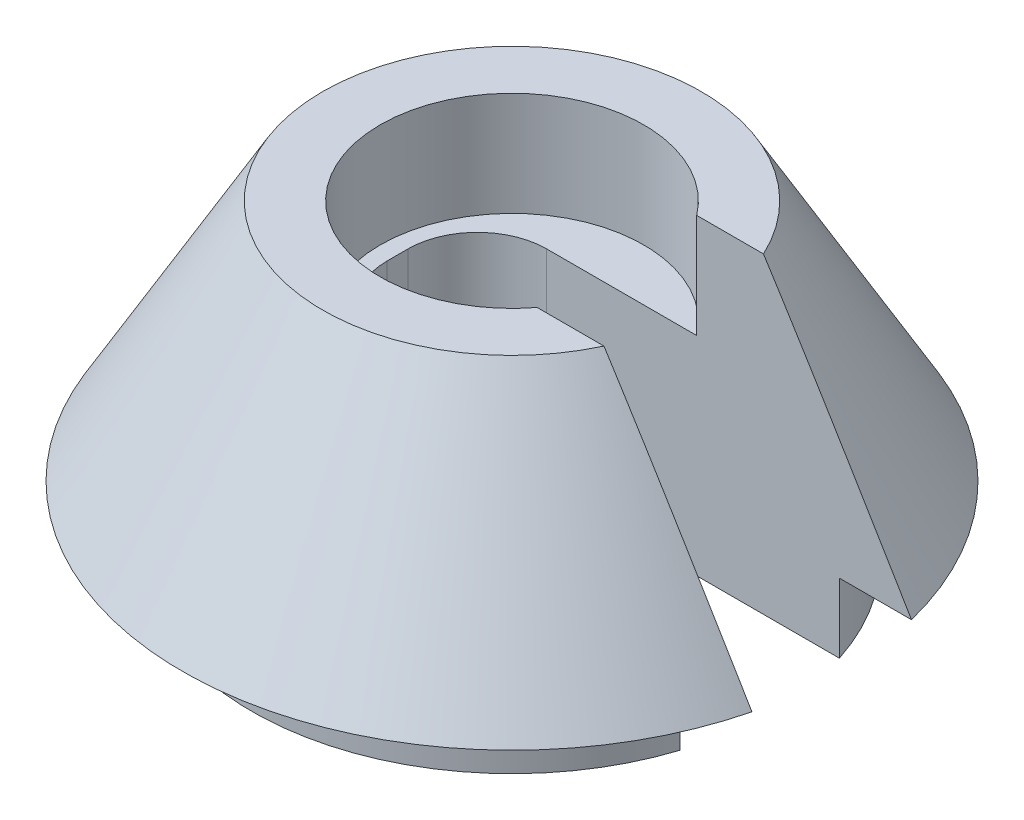
ISO-10303-21;
HEADER;
FILE_DESCRIPTION(('STEP AP214'),'2;1');
FILE_NAME('part.step','',(''),(''),'','','');
FILE_SCHEMA(('AUTOMOTIVE_DESIGN { 1 0 10303 214 1 1 1 1 }'));
ENDSEC;
DATA;
#1=APPLICATION_CONTEXT('core data for automotive mechanical design processes');
#2=APPLICATION_PROTOCOL_DEFINITION('international standard','automotive_design',2000,#1);
#3=PRODUCT_CONTEXT('',#1,'mechanical');
#4=PRODUCT('Part','Part','',(#3));
#5=PRODUCT_RELATED_PRODUCT_CATEGORY('part','',(#4));
#6=PRODUCT_DEFINITION_FORMATION('','',#4);
#7=PRODUCT_DEFINITION_CONTEXT('part definition',#1,'design');
#8=PRODUCT_DEFINITION('design','',#6,#7);
#9=PRODUCT_DEFINITION_SHAPE('','',#8);
#10=(LENGTH_UNIT() NAMED_UNIT(*) SI_UNIT(.MILLI.,.METRE.));
#11=(NAMED_UNIT(*) PLANE_ANGLE_UNIT() SI_UNIT($,.RADIAN.));
#12=(NAMED_UNIT(*) SI_UNIT($,.STERADIAN.) SOLID_ANGLE_UNIT());
#13=UNCERTAINTY_MEASURE_WITH_UNIT(LENGTH_MEASURE(1.E-05),#10,'distance_accuracy_value','');
#14=(GEOMETRIC_REPRESENTATION_CONTEXT(3) GLOBAL_UNCERTAINTY_ASSIGNED_CONTEXT((#13)) GLOBAL_UNIT_ASSIGNED_CONTEXT((#10,
#11,#12)) REPRESENTATION_CONTEXT('',''));
#15=CARTESIAN_POINT('',(0.,0.,0.));
#16=DIRECTION('',(0.,0.,1.));
#17=DIRECTION('',(1.,0.,0.));
#18=AXIS2_PLACEMENT_3D('',#15,#16,#17);
#19=CARTESIAN_POINT('',(0.,2.,0.));
#20=DIRECTION('',(0.,-1.,0.));
#21=DIRECTION('',(0.,0.,-1.));
#22=AXIS2_PLACEMENT_3D('',#19,#20,#21);
#23=CYLINDRICAL_SURFACE('',#22,7.5);
#24=CARTESIAN_POINT('',(0.,2.,0.));
#25=DIRECTION('',(0.,1.,0.));
#26=DIRECTION('',(0.,0.,1.));
#27=AXIS2_PLACEMENT_3D('',#24,#25,#26);
#28=CIRCLE('',#27,7.5);
#29=CARTESIAN_POINT('',(7.1386273190299,2.,-2.3));
#30=VERTEX_POINT('',#29);
#31=CARTESIAN_POINT('',(7.1386273190299,2.,2.3));
#32=VERTEX_POINT('',#31);
#33=EDGE_CURVE('E197',#30,#32,#28,.T.);
#34=ORIENTED_EDGE('',*,*,#33,.F.);
#35=DIRECTION('',(0.,-1.,0.));
#36=VECTOR('',#35,1.);
#37=CARTESIAN_POINT('',(7.1386273190299,2.,-2.3));
#38=LINE('',#37,#36);
#39=CARTESIAN_POINT('',(7.1386273190299,0.,-2.3));
#40=VERTEX_POINT('',#39);
#41=EDGE_CURVE('E57',#30,#40,#38,.T.);
#42=ORIENTED_EDGE('',*,*,#41,.T.);
#43=CARTESIAN_POINT('',(0.,0.,0.));
#44=DIRECTION('',(0.,1.,0.));
#45=DIRECTION('',(0.,0.,1.));
#46=AXIS2_PLACEMENT_3D('',#43,#44,#45);
#47=CIRCLE('',#46,7.5);
#48=CARTESIAN_POINT('',(7.1386273190299,0.,2.3));
#49=VERTEX_POINT('',#48);
#50=EDGE_CURVE('E199',#40,#49,#47,.T.);
#51=ORIENTED_EDGE('',*,*,#50,.T.);
#52=DIRECTION('',(0.,-1.,0.));
#53=VECTOR('',#52,1.);
#54=CARTESIAN_POINT('',(7.1386273190299,2.,2.3));
#55=LINE('',#54,#53);
#56=EDGE_CURVE('E124',#49,#32,#55,.F.);
#57=ORIENTED_EDGE('',*,*,#56,.T.);
#58=EDGE_LOOP('',(#34,#42,#51,#57));
#59=FACE_BOUND('',#58,.T.);
#60=ADVANCED_FACE('F35',(#59),#23,.T.);
#61=CARTESIAN_POINT('',(0.,0.,0.));
#62=DIRECTION('',(0.,1.,0.));
#63=DIRECTION('',(0.,0.,1.));
#64=AXIS2_PLACEMENT_3D('',#61,#62,#63);
#65=PLANE('',#64);
#66=ORIENTED_EDGE('',*,*,#50,.F.);
#67=DIRECTION('',(1.,0.,0.));
#68=VECTOR('',#67,1.);
#69=CARTESIAN_POINT('',(-1.3,0.,-2.3));
#70=LINE('',#69,#68);
#71=CARTESIAN_POINT('',(-1.3,0.,-2.3));
#72=VERTEX_POINT('',#71);
#73=EDGE_CURVE('E140',#72,#40,#70,.T.);
#74=ORIENTED_EDGE('',*,*,#73,.F.);
#75=CARTESIAN_POINT('',(-1.3,0.,-0.3));
#76=DIRECTION('',(0.,-1.,0.));
#77=DIRECTION('',(0.,0.,1.));
#78=AXIS2_PLACEMENT_3D('',#75,#76,#77);
#79=CIRCLE('',#78,2.);
#80=CARTESIAN_POINT('',(-3.3,0.,-0.3));
#81=VERTEX_POINT('',#80);
#82=EDGE_CURVE('E134',#81,#72,#79,.T.);
#83=ORIENTED_EDGE('',*,*,#82,.F.);
#84=DIRECTION('',(0.,0.,-1.));
#85=VECTOR('',#84,1.);
#86=CARTESIAN_POINT('',(-3.3,0.,0.3));
#87=LINE('',#86,#85);
#88=CARTESIAN_POINT('',(-3.3,0.,0.3));
#89=VERTEX_POINT('',#88);
#90=EDGE_CURVE('E132',#89,#81,#87,.T.);
#91=ORIENTED_EDGE('',*,*,#90,.F.);
#92=CARTESIAN_POINT('',(-1.3,0.,0.3));
#93=DIRECTION('',(0.,-1.,0.));
#94=DIRECTION('',(0.,0.,-1.));
#95=AXIS2_PLACEMENT_3D('',#92,#93,#94);
#96=CIRCLE('',#95,2.);
#97=CARTESIAN_POINT('',(-1.3,0.,2.3));
#98=VERTEX_POINT('',#97);
#99=EDGE_CURVE('E112',#98,#89,#96,.T.);
#100=ORIENTED_EDGE('',*,*,#99,.F.);
#101=DIRECTION('',(-1.,0.,0.));
#102=VECTOR('',#101,1.);
#103=CARTESIAN_POINT('',(-1.3,0.,2.3));
#104=LINE('',#103,#102);
#105=EDGE_CURVE('E121',#49,#98,#104,.T.);
#106=ORIENTED_EDGE('',*,*,#105,.F.);
#107=EDGE_LOOP('',(#66,#74,#83,#91,#100,#106));
#108=FACE_BOUND('',#107,.T.);
#109=ADVANCED_FACE('F129',(#108),#65,.F.);
#110=CARTESIAN_POINT('',(0.,2.,0.));
#111=DIRECTION('',(0.,-1.,0.));
#112=DIRECTION('',(0.,0.,1.));
#113=AXIS2_PLACEMENT_3D('',#110,#111,#112);
#114=CONICAL_SURFACE('',#113,9.5,0.523598775598299);
#115=CARTESIAN_POINT('',(0.,9.,0.));
#116=DIRECTION('',(0.,1.,0.));
#117=DIRECTION('',(0.,0.,1.));
#118=AXIS2_PLACEMENT_3D('',#115,#116,#117);
#119=CIRCLE('',#118,5.45854811567261);
#120=CARTESIAN_POINT('',(4.95032802257719,9.,-2.3));
#121=VERTEX_POINT('',#120);
#122=CARTESIAN_POINT('',(4.9503280225772,9.,2.3));
#123=VERTEX_POINT('',#122);
#124=EDGE_CURVE('E202',#121,#123,#119,.T.);
#125=ORIENTED_EDGE('',*,*,#124,.F.);
#126=CARTESIAN_POINT('',(-9.02227226073416,2.32766679770154,-2.3));
#127=CARTESIAN_POINT('',(-8.76048081901102,2.76699331251077,-2.3));
#128=CARTESIAN_POINT('',(-8.4982234552487,3.20604381628601,-2.3));
#129=CARTESIAN_POINT('',(-7.97231107192896,4.08340899491022,-2.3));
#130=CARTESIAN_POINT('',(-7.70865582039627,4.52172353065726,-2.3));
#131=CARTESIAN_POINT('',(-7.17811253297956,5.39969624100742,-2.3));
#132=CARTESIAN_POINT('',(-6.91121468758503,5.83934849607817,-2.3));
#133=CARTESIAN_POINT('',(-6.37495789635586,6.71705752377118,-2.3));
#134=CARTESIAN_POINT('',(-6.10559933638778,7.15511453197367,-2.3));
#135=CARTESIAN_POINT('',(-5.55842520019664,8.03684403645215,-2.3));
#136=CARTESIAN_POINT('',(-5.28054459019501,8.48047634095248,-2.3));
#137=CARTESIAN_POINT('',(-4.85931284397125,9.14327504399018,-2.3));
#138=CARTESIAN_POINT('',(-4.71813215244396,9.3638197845287,-2.3));
#139=CARTESIAN_POINT('',(-4.43390068329386,9.80369367167796,-2.3));
#140=CARTESIAN_POINT('',(-4.2908499602841,10.0230228535231,-2.3));
#141=CARTESIAN_POINT('',(-4.00270052749667,10.4594718070054,-2.3));
#142=CARTESIAN_POINT('',(-3.85760852180716,10.6765959924094,-2.3));
#143=CARTESIAN_POINT('',(-3.5641580596759,11.1086179141015,-2.3));
#144=CARTESIAN_POINT('',(-3.41579973013529,11.3235157364114,-2.3));
#145=CARTESIAN_POINT('',(-3.11465162541859,11.7499740103536,-2.3));
#146=CARTESIAN_POINT('',(-2.96186521416853,11.9615368161789,-2.3));
#147=CARTESIAN_POINT('',(-2.72772517259241,12.2751452427334,-2.3));
#148=CARTESIAN_POINT('',(-2.64886038607054,12.3790479274987,-2.3));
#149=CARTESIAN_POINT('',(-2.48907009561985,12.5852538000697,-2.3));
#150=CARTESIAN_POINT('',(-2.40814473721937,12.6875571000133,-2.3));
#151=CARTESIAN_POINT('',(-2.2986923644941,12.8223544524843,-2.3));
#152=CARTESIAN_POINT('',(-2.27131400829398,12.8557829894955,-2.3));
#153=CARTESIAN_POINT('',(-2.21624784689734,12.922385697809,-2.3));
#154=CARTESIAN_POINT('',(-2.18856003351631,12.9555598623444,-2.3));
#155=CARTESIAN_POINT('',(-2.10499151182393,13.0546665198831,-2.3));
#156=CARTESIAN_POINT('',(-2.048609601339,13.1201783830528,-2.3));
#157=CARTESIAN_POINT('',(-1.93406611944812,13.2500433163037,-2.3));
#158=CARTESIAN_POINT('',(-1.87589896605747,13.3143914767493,-2.3));
#159=CARTESIAN_POINT('',(-1.75767083595127,13.4413237231877,-2.3));
#160=CARTESIAN_POINT('',(-1.69760996891939,13.5039079109535,-2.3));
#161=CARTESIAN_POINT('',(-1.57061430466078,13.63142832615,-2.3));
#162=CARTESIAN_POINT('',(-1.50350184027373,13.6961888044607,-2.3));
#163=CARTESIAN_POINT('',(-1.36605729857718,13.8221903525793,-2.3));
#164=CARTESIAN_POINT('',(-1.2957261384372,13.8834324138818,-2.3));
#165=CARTESIAN_POINT('',(-1.15134812500449,14.0008713142326,-2.3));
#166=CARTESIAN_POINT('',(-1.07731568329189,14.057085657047,-2.3));
#167=CARTESIAN_POINT('',(-0.924566017389596,14.1626569964064,-2.3));
#168=CARTESIAN_POINT('',(-0.845855178656293,14.2120230464006,-2.3));
#169=CARTESIAN_POINT('',(-0.688597161091895,14.2979219788125,-2.3));
#170=CARTESIAN_POINT('',(-0.61041374579529,14.3351054945225,-2.3));
#171=CARTESIAN_POINT('',(-0.449453073535874,14.3976778087935,-2.3));
#172=CARTESIAN_POINT('',(-0.366683732132211,14.4230862628383,-2.3));
#173=CARTESIAN_POINT('',(-0.196724686216108,14.4589066011876,-2.3));
#174=CARTESIAN_POINT('',(-0.109492772838284,14.4691278080296,-2.3));
#175=CARTESIAN_POINT('',(0.0652602927911298,14.4720354842825,-2.3));
#176=CARTESIAN_POINT('',(0.152781396624484,14.464724753842,-2.3));
#177=CARTESIAN_POINT('',(0.330808845478698,14.4329075112669,-2.3));
#178=CARTESIAN_POINT('',(0.421097972123779,14.4072377862862,-2.3));
#179=CARTESIAN_POINT('',(0.596353986083074,14.3417260417928,-2.3));
#180=CARTESIAN_POINT('',(0.681308634660857,14.3018527393977,-2.3));
#181=CARTESIAN_POINT('',(0.855532952447854,14.20679276748,-2.3));
#182=CARTESIAN_POINT('',(0.944094346223919,14.1503416956198,-2.3));
#183=CARTESIAN_POINT('',(1.11539318251492,14.0291066724772,-2.3));
#184=CARTESIAN_POINT('',(1.19812003760868,13.9643081467688,-2.3));
#185=CARTESIAN_POINT('',(1.3593638729724,13.8286179616144,-2.3));
#186=CARTESIAN_POINT('',(1.43784673530756,13.7576862521284,-2.3));
#187=CARTESIAN_POINT('',(1.55264793943583,13.6483292830746,-2.3));
#188=CARTESIAN_POINT('',(1.59041359560839,13.6113987799076,-2.3));
#189=CARTESIAN_POINT('',(1.66508771055953,13.536682062011,-2.3));
#190=CARTESIAN_POINT('',(1.7019961946233,13.4988958725878,-2.3));
#191=CARTESIAN_POINT('',(1.81712591503382,13.3786564528829,-2.3));
#192=CARTESIAN_POINT('',(1.89396862641392,13.2948827358948,-2.3));
#193=CARTESIAN_POINT('',(2.04488268109945,13.1248667714919,-2.3));
#194=CARTESIAN_POINT('',(2.11895347889032,13.0386240440072,-2.3));
#195=CARTESIAN_POINT('',(2.26490681983974,12.8642205775673,-2.3));
#196=CARTESIAN_POINT('',(2.33678797495557,12.7760586803314,-2.3));
#197=CARTESIAN_POINT('',(2.47873003121087,12.5982787543074,-2.3));
#198=CARTESIAN_POINT('',(2.54879082925597,12.5086606435129,-2.3));
#199=CARTESIAN_POINT('',(2.75707158164951,12.2376554696934,-2.3));
#200=CARTESIAN_POINT('',(2.89304188021021,12.0545406648167,-2.3));
#201=CARTESIAN_POINT('',(3.16072862693392,11.6853544026872,-2.3));
#202=CARTESIAN_POINT('',(3.29244658383279,11.4992840298245,-2.3));
#203=CARTESIAN_POINT('',(3.55301861073383,11.1246828492051,-2.3));
#204=CARTESIAN_POINT('',(3.68186741922924,10.9361483897038,-2.3));
#205=CARTESIAN_POINT('',(3.93723765734981,10.5574906035089,-2.3));
#206=CARTESIAN_POINT('',(4.06375888458695,10.367367140719,-2.3));
#207=CARTESIAN_POINT('',(4.31479564116184,9.9862205942107,-2.3));
#208=CARTESIAN_POINT('',(4.43931395022681,9.79519933855271,-2.3));
#209=CARTESIAN_POINT('',(4.68691395403455,9.41223761712044,-2.3));
#210=CARTESIAN_POINT('',(4.80999569267582,9.22029717968849,-2.3));
#211=CARTESIAN_POINT('',(5.12730361679959,8.72220051158589,-2.3));
#212=CARTESIAN_POINT('',(5.32065135819332,8.41548493767876,-2.3));
#213=CARTESIAN_POINT('',(5.7052279115484,7.80072706083927,-2.3));
#214=CARTESIAN_POINT('',(5.89645670305176,7.49268474513731,-2.3));
#215=CARTESIAN_POINT('',(6.27731745981113,6.87559888526515,-2.3));
#216=CARTESIAN_POINT('',(6.46694936319041,6.56655530293421,-2.3));
#217=CARTESIAN_POINT('',(6.84496887346653,5.94770771807484,-2.3));
#218=CARTESIAN_POINT('',(7.03335647735985,5.63790371371336,-2.3));
#219=CARTESIAN_POINT('',(7.59735587972217,4.70711704328475,-2.3));
#220=CARTESIAN_POINT('',(7.97150426119612,4.08524788776677,-2.3));
#221=CARTESIAN_POINT('',(8.7172472013882,2.84000060640084,-2.3));
#222=CARTESIAN_POINT('',(9.08884181266399,2.21662251196668,-2.3));
#223=CARTESIAN_POINT('',(9.82108907009911,0.98423634727478,-2.3));
#224=CARTESIAN_POINT('',(10.1817851007458,0.375254043680828,-2.3));
#225=CARTESIAN_POINT('',(10.9019491162219,-0.843441421712044,-2.3));
#226=CARTESIAN_POINT('',(11.2614170927192,-1.45315458843187,-2.3));
#227=CARTESIAN_POINT('',(11.9790855462629,-2.67253479798948,-2.3));
#228=CARTESIAN_POINT('',(12.3372869112762,-3.28220131839225,-2.3));
#229=CARTESIAN_POINT('',(13.0529661156073,-4.50195189414921,-2.3));
#230=CARTESIAN_POINT('',(13.4104439611124,-5.11203594587253,-2.3));
#231=CARTESIAN_POINT('',(13.7676611312266,-5.72227226073416,-2.3));
#232=B_SPLINE_CURVE_WITH_KNOTS('',3,(#126,#127,#128,#129,#130,#131,#132,#133,#134,#135,#136,
#137,#138,#139,#140,#141,#142,#143,#144,#145,#146,#147,#148,#149,#150,#151,#152,#153,#154,#155,
#156,#157,#158,#159,#160,#161,#162,#163,#164,#165,#166,#167,#168,#169,#170,#171,#172,#173,#174,
#175,#176,#177,#178,#179,#180,#181,#182,#183,#184,#185,#186,#187,#188,#189,#190,#191,#192,#193,
#194,#195,#196,#197,#198,#199,#200,#201,#202,#203,#204,#205,#206,#207,#208,#209,#210,#211,#212,
#213,#214,#215,#216,#217,#218,#219,#220,#221,#222,#223,#224,#225,#226,#227,#228,#229,#230,#231),
.UNSPECIFIED.,.F.,.F.,(4,2,2,2,2,2,2,2,2,2,2,2,2,2,2,2,2,2,2,2,2,2,2,2,2,2,2,2,2,2,2,2,2,2,2,2,
2,2,2,2,2,2,2,2,2,2,2,2,2,2,2,2,4),(0.,1.53423867632177,3.06874046386846,4.61170426627738,
6.15443013234436,7.72482452498283,8.51040500480131,9.29596259328385,10.0793625859244,
10.8627321959259,11.6455215371996,12.0368331720317,12.4281172466326,12.5577435449833,
12.6873732798318,12.9466512469107,13.206844906438,13.4670235231628,13.7467198266648,
14.0263369208126,14.3049392121731,14.5831696077452,14.8421939478208,15.1007843409906,
15.3625947106191,15.6243632674664,15.9043800548083,16.1850174217522,16.4993789099429,
16.8142968985596,17.1314541709012,17.289908643071,17.448358435137,17.7893040352139,
18.1303163844949,18.4715405879661,18.8127840744414,19.4969136207938,20.1807977082458,
20.8658469246701,21.5509554286617,22.2350126751318,22.9190489632691,24.0067489459401,
25.0944594209805,26.1822118508074,27.2699669053184,29.44719593497,31.6243800213273,
33.7477360747015,35.8711065058468,37.9924294543908,40.1137341844115),.UNSPECIFIED.);
#233=CARTESIAN_POINT('',(9.21737489744233,2.,-2.3));
#234=VERTEX_POINT('',#233);
#235=EDGE_CURVE('E230',#121,#234,#232,.T.);
#236=ORIENTED_EDGE('',*,*,#235,.T.);
#237=CARTESIAN_POINT('',(0.,2.,0.));
#238=DIRECTION('',(0.,1.,0.));
#239=DIRECTION('',(0.,0.,1.));
#240=AXIS2_PLACEMENT_3D('',#237,#238,#239);
#241=CIRCLE('',#240,9.5);
#242=CARTESIAN_POINT('',(9.21737489744233,2.,2.3));
#243=VERTEX_POINT('',#242);
#244=EDGE_CURVE('E228',#234,#243,#241,.T.);
#245=ORIENTED_EDGE('',*,*,#244,.T.);
#246=CARTESIAN_POINT('',(13.7676611312266,-5.72227226073416,2.3));
#247=CARTESIAN_POINT('',(13.3946257402136,-5.08501709047818,2.3));
#248=CARTESIAN_POINT('',(13.0213081145206,-4.44792678060563,2.3));
#249=CARTESIAN_POINT('',(12.2738695985365,-3.17419866127775,2.3));
#250=CARTESIAN_POINT('',(11.8997486906679,-2.53756086213845,2.3));
#251=CARTESIAN_POINT('',(11.1497669507246,-1.26367539011608,2.3));
#252=CARTESIAN_POINT('',(10.7739041612337,-0.626428869008985,2.3));
#253=CARTESIAN_POINT('',(10.0207841519572,0.647222855149875,2.3));
#254=CARTESIAN_POINT('',(9.64352695977841,1.28362807452293,2.3));
#255=CARTESIAN_POINT('',(8.84979588506886,2.61793406097305,2.3));
#256=CARTESIAN_POINT('',(8.433120671541,3.31571526710163,2.3));
#257=CARTESIAN_POINT('',(7.80538707010242,4.3607835317233,2.3));
#258=CARTESIAN_POINT('',(7.59568231590529,4.7088834805976,2.3));
#259=CARTESIAN_POINT('',(7.1751159764022,5.40438357830228,2.3));
#260=CARTESIAN_POINT('',(6.96425439296672,5.75178372826293,2.3));
#261=CARTESIAN_POINT('',(6.54137761328337,6.44511396325762,2.3));
#262=CARTESIAN_POINT('',(6.32936482382185,6.79104551515455,2.3));
#263=CARTESIAN_POINT('',(5.90336370995101,7.48168908810181,2.3));
#264=CARTESIAN_POINT('',(5.6893753976263,7.82640111659435,2.3));
#265=CARTESIAN_POINT('',(5.25871428685164,8.51409313135961,2.3));
#266=CARTESIAN_POINT('',(5.04204178703912,8.85707330444352,2.3));
#267=CARTESIAN_POINT('',(4.60486832841559,9.54058132714478,2.3));
#268=CARTESIAN_POINT('',(4.38436749861839,9.88110925885704,2.3));
#269=CARTESIAN_POINT('',(4.0545448084372,10.3810591637524,2.3));
#270=CARTESIAN_POINT('',(3.94745820584747,10.5419549087546,2.3));
#271=CARTESIAN_POINT('',(3.73163044678484,10.8626495136596,2.3));
#272=CARTESIAN_POINT('',(3.62288918796933,11.0224483048199,2.3));
#273=CARTESIAN_POINT('',(3.40301219928779,11.3410754576042,2.3));
#274=CARTESIAN_POINT('',(3.29187045518707,11.4998996774231,2.3));
#275=CARTESIAN_POINT('',(3.06690651950596,11.81560643677,2.3));
#276=CARTESIAN_POINT('',(2.95308477570648,11.9724892940763,2.3));
#277=CARTESIAN_POINT('',(2.7236380677271,12.2812185167652,2.3));
#278=CARTESIAN_POINT('',(2.60806754760226,12.433105224892,2.3));
#279=CARTESIAN_POINT('',(2.3721332606971,12.7333220600954,2.3));
#280=CARTESIAN_POINT('',(2.25176626365555,12.8816496787385,2.3));
#281=CARTESIAN_POINT('',(2.0664809584897,13.0995807950363,2.3));
#282=CARTESIAN_POINT('',(2.0040702790718,13.1713140153739,2.3));
#283=CARTESIAN_POINT('',(1.87724292224634,13.3129797987885,2.3));
#284=CARTESIAN_POINT('',(1.81282645878833,13.3829125524707,2.3));
#285=CARTESIAN_POINT('',(1.68162904866014,13.5203715117652,2.3));
#286=CARTESIAN_POINT('',(1.61485108105909,13.5879005479677,2.3));
#287=CARTESIAN_POINT('',(1.47831794548817,13.7198625860499,2.3));
#288=CARTESIAN_POINT('',(1.40856381364093,13.784296649073,2.3));
#289=CARTESIAN_POINT('',(1.28446452305294,13.8923139259231,2.3));
#290=CARTESIAN_POINT('',(1.23097283899774,13.936873998916,2.3));
#291=CARTESIAN_POINT('',(1.1216466079429,14.0230995146661,2.3));
#292=CARTESIAN_POINT('',(1.06581097766614,14.0647635948549,2.3));
#293=CARTESIAN_POINT('',(0.951704965703614,14.1441378645687,2.3));
#294=CARTESIAN_POINT('',(0.893445441354485,14.1818634850189,2.3));
#295=CARTESIAN_POINT('',(0.77402467421746,14.2523529110068,2.3));
#296=CARTESIAN_POINT('',(0.712865499561458,14.2851201851207,2.3));
#297=CARTESIAN_POINT('',(0.574536152595027,14.3502875423334,2.3));
#298=CARTESIAN_POINT('',(0.496657058940019,14.3812305647362,2.3));
#299=CARTESIAN_POINT('',(0.336955328652336,14.4305297896837,2.3));
#300=CARTESIAN_POINT('',(0.25513666322159,14.4488983946231,2.3));
#301=CARTESIAN_POINT('',(0.0886913155234731,14.4704078109665,2.3));
#302=CARTESIAN_POINT('',(0.00404635291553642,14.4734142613611,2.3));
#303=CARTESIAN_POINT('',(-0.164228530990328,14.4632882333614,2.3));
#304=CARTESIAN_POINT('',(-0.247858186818413,14.4501516221066,2.3));
#305=CARTESIAN_POINT('',(-0.42797013235243,14.4059002133854,2.3));
#306=CARTESIAN_POINT('',(-0.52367896325873,14.3717159849582,2.3));
#307=CARTESIAN_POINT('',(-0.662252486999437,14.3096444282186,2.3));
#308=CARTESIAN_POINT('',(-0.707689448595765,14.2871042541352,2.3));
#309=CARTESIAN_POINT('',(-0.796956392647637,14.2390287929728,2.3));
#310=CARTESIAN_POINT('',(-0.840786499414785,14.2134937382323,2.3));
#311=CARTESIAN_POINT('',(-0.994305494784764,14.1181411278347,2.3));
#312=CARTESIAN_POINT('',(-1.0997650452158,14.0415368400698,2.3));
#313=CARTESIAN_POINT('',(-1.30293416162397,13.8786081854296,2.3));
#314=CARTESIAN_POINT('',(-1.40062616474463,13.7922628023275,2.3));
#315=CARTESIAN_POINT('',(-1.5907667447009,13.6127405113365,2.3));
#316=CARTESIAN_POINT('',(-1.68317381691367,13.5195200020207,2.3));
#317=CARTESIAN_POINT('',(-1.81832827696886,13.37657161714,2.3));
#318=CARTESIAN_POINT('',(-1.8627819335703,13.3284279144305,2.3));
#319=CARTESIAN_POINT('',(-1.9506971649821,13.2312442893348,2.3));
#320=CARTESIAN_POINT('',(-1.99415877588871,13.1822043996744,2.3));
#321=CARTESIAN_POINT('',(-2.13248479437058,13.0233543933406,2.3));
#322=CARTESIAN_POINT('',(-2.2256661734999,12.9120789965296,2.3));
#323=CARTESIAN_POINT('',(-2.40882399846606,12.6869129852964,2.3));
#324=CARTESIAN_POINT('',(-2.49879992313158,12.5730219505066,2.3));
#325=CARTESIAN_POINT('',(-2.67629008753612,12.3432510411781,2.3));
#326=CARTESIAN_POINT('',(-2.76380306374505,12.2273701932049,2.3));
#327=CARTESIAN_POINT('',(-2.93683564416563,11.9941271197814,2.3));
#328=CARTESIAN_POINT('',(-3.02235516408042,11.876764832008,2.3));
#329=CARTESIAN_POINT('',(-3.27685524841083,11.5224906160586,2.3));
#330=CARTESIAN_POINT('',(-3.44342815190518,11.2838506307626,2.3));
#331=CARTESIAN_POINT('',(-3.77217433125961,10.8036857189839,2.3));
#332=CARTESIAN_POINT('',(-3.93434889574194,10.5621616680048,2.3));
#333=CARTESIAN_POINT('',(-4.2552579972151,10.0775386939444,2.3));
#334=CARTESIAN_POINT('',(-4.41399877788363,9.83444389792703,2.3));
#335=CARTESIAN_POINT('',(-4.72919112376227,9.34675326354049,2.3));
#336=CARTESIAN_POINT('',(-4.88564252172293,9.10215731734018,2.3));
#337=CARTESIAN_POINT('',(-5.19662067991437,8.6121188191301,2.3));
#338=CARTESIAN_POINT('',(-5.35114934571052,8.3666774749462,2.3));
#339=CARTESIAN_POINT('',(-5.65883679152087,7.87493718655567,2.3));
#340=CARTESIAN_POINT('',(-5.81199556590894,7.62863823883264,2.3));
#341=CARTESIAN_POINT('',(-6.22386719805366,6.96303666100427,2.3));
#342=CARTESIAN_POINT('',(-6.48155732098889,6.54310140718518,2.3));
#343=CARTESIAN_POINT('',(-6.99482194145663,5.70175247544056,2.3));
#344=CARTESIAN_POINT('',(-7.25039571318198,5.2803383555824,2.3));
#345=CARTESIAN_POINT('',(-7.75941834348221,4.43738659139885,2.3));
#346=CARTESIAN_POINT('',(-8.01287044367205,4.01585090302552,2.3));
#347=CARTESIAN_POINT('',(-8.51845008316038,3.1721845295481,2.3));
#348=CARTESIAN_POINT('',(-8.77057805163473,2.75005410171954,2.3));
#349=CARTESIAN_POINT('',(-9.02227226073416,2.32766679770154,2.3));
#350=B_SPLINE_CURVE_WITH_KNOTS('',3,(#246,#247,#248,#249,#250,#251,#252,#253,#254,#255,#256,
#257,#258,#259,#260,#261,#262,#263,#264,#265,#266,#267,#268,#269,#270,#271,#272,#273,#274,#275,
#276,#277,#278,#279,#280,#281,#282,#283,#284,#285,#286,#287,#288,#289,#290,#291,#292,#293,#294,
#295,#296,#297,#298,#299,#300,#301,#302,#303,#304,#305,#306,#307,#308,#309,#310,#311,#312,#313,
#314,#315,#316,#317,#318,#319,#320,#321,#322,#323,#324,#325,#326,#327,#328,#329,#330,#331,#332,
#333,#334,#335,#336,#337,#338,#339,#340,#341,#342,#343,#344,#345,#346,#347,#348,#349),
.UNSPECIFIED.,.F.,.F.,(4,2,2,2,2,2,2,2,2,2,2,2,2,2,2,2,2,2,2,2,2,2,2,2,2,2,2,2,2,2,2,2,2,2,2,2,
2,2,2,2,2,2,2,2,2,2,2,2,2,2,2,4),(0.,2.21523083215538,4.43051064215589,6.65001447532256,
8.86947459884844,11.3076317744991,12.5267884228447,13.7459431005169,14.9631330132978,
16.1803154852568,17.3973637308589,18.6143710415284,19.194186574499,19.7740381167631,
20.3555662283548,20.936997856785,21.5095104752896,22.0824154027707,22.3676353054089,
22.6528248882184,22.9376667068788,23.2224101571015,23.4311927583839,23.6400729363608,
23.8481013104277,24.0559834801888,24.3065528581873,24.5568747372237,24.8093822876515,
25.0619544971838,25.3650264235751,25.517111915739,25.6691856171302,26.0591448970924,
26.4499622045647,26.8435160448568,27.0400924347071,27.2366616605537,27.6719838189515,
28.1073764358467,28.5429884881576,28.9786189278066,29.851610015152,30.7243425089947,
31.5953256846076,32.4663721748609,33.3364727487792,34.2065768945535,35.684655401493,
37.1632214081212,38.6388113407599,40.1138891522892),.UNSPECIFIED.);
#351=EDGE_CURVE('E154',#243,#123,#350,.T.);
#352=ORIENTED_EDGE('',*,*,#351,.T.);
#353=EDGE_LOOP('',(#125,#236,#245,#352));
#354=FACE_BOUND('',#353,.T.);
#355=ADVANCED_FACE('F163',(#354),#114,.T.);
#356=CARTESIAN_POINT('',(0.,9.,0.));
#357=DIRECTION('',(0.,1.,0.));
#358=DIRECTION('',(0.,0.,1.));
#359=AXIS2_PLACEMENT_3D('',#356,#357,#358);
#360=PLANE('',#359);
#361=DIRECTION('',(1.,0.,0.));
#362=VECTOR('',#361,1.);
#363=CARTESIAN_POINT('',(-1.3,9.,-2.3));
#364=LINE('',#363,#362);
#365=CARTESIAN_POINT('',(3.02489669245084,9.,-2.3));
#366=VERTEX_POINT('',#365);
#367=EDGE_CURVE('E118',#366,#121,#364,.T.);
#368=ORIENTED_EDGE('',*,*,#367,.T.);
#369=ORIENTED_EDGE('',*,*,#124,.T.);
#370=DIRECTION('',(-1.,0.,0.));
#371=VECTOR('',#370,1.);
#372=CARTESIAN_POINT('',(-1.3,9.,2.3));
#373=LINE('',#372,#371);
#374=CARTESIAN_POINT('',(3.02489669245083,9.,2.3));
#375=VERTEX_POINT('',#374);
#376=EDGE_CURVE('E142',#123,#375,#373,.T.);
#377=ORIENTED_EDGE('',*,*,#376,.T.);
#378=CARTESIAN_POINT('',(0.,9.,0.));
#379=DIRECTION('',(0.,1.,0.));
#380=DIRECTION('',(0.,0.,1.));
#381=AXIS2_PLACEMENT_3D('',#378,#379,#380);
#382=CIRCLE('',#381,3.8);
#383=EDGE_CURVE('E224',#366,#375,#382,.T.);
#384=ORIENTED_EDGE('',*,*,#383,.F.);
#385=EDGE_LOOP('',(#368,#369,#377,#384));
#386=FACE_BOUND('',#385,.T.);
#387=ADVANCED_FACE('F182',(#386),#360,.T.);
#388=CARTESIAN_POINT('',(0.,2.,0.));
#389=DIRECTION('',(0.,1.,0.));
#390=DIRECTION('',(0.,0.,1.));
#391=AXIS2_PLACEMENT_3D('',#388,#389,#390);
#392=PLANE('',#391);
#393=ORIENTED_EDGE('',*,*,#244,.F.);
#394=DIRECTION('',(-1.,0.,0.));
#395=VECTOR('',#394,1.);
#396=CARTESIAN_POINT('',(0.,2.,-2.3));
#397=LINE('',#396,#395);
#398=EDGE_CURVE('E237',#234,#30,#397,.T.);
#399=ORIENTED_EDGE('',*,*,#398,.T.);
#400=ORIENTED_EDGE('',*,*,#33,.T.);
#401=DIRECTION('',(1.,0.,0.));
#402=VECTOR('',#401,1.);
#403=CARTESIAN_POINT('',(0.,2.,2.3));
#404=LINE('',#403,#402);
#405=EDGE_CURVE('E151',#32,#243,#404,.T.);
#406=ORIENTED_EDGE('',*,*,#405,.T.);
#407=EDGE_LOOP('',(#393,#399,#400,#406));
#408=FACE_BOUND('',#407,.T.);
#409=ADVANCED_FACE('F180',(#408),#392,.F.);
#410=CARTESIAN_POINT('',(0.,6.,0.));
#411=DIRECTION('',(0.,1.,0.));
#412=DIRECTION('',(0.,0.,1.));
#413=AXIS2_PLACEMENT_3D('',#410,#411,#412);
#414=CYLINDRICAL_SURFACE('',#413,3.8);
#415=CARTESIAN_POINT('',(0.,6.,0.));
#416=DIRECTION('',(0.,1.,0.));
#417=DIRECTION('',(0.,0.,1.));
#418=AXIS2_PLACEMENT_3D('',#415,#416,#417);
#419=CIRCLE('',#418,3.8);
#420=CARTESIAN_POINT('',(3.02489669245083,6.,-2.3));
#421=VERTEX_POINT('',#420);
#422=CARTESIAN_POINT('',(3.02489669245083,6.,2.3));
#423=VERTEX_POINT('',#422);
#424=EDGE_CURVE('E219',#421,#423,#419,.T.);
#425=ORIENTED_EDGE('',*,*,#424,.F.);
#426=DIRECTION('',(0.,1.,0.));
#427=VECTOR('',#426,1.);
#428=CARTESIAN_POINT('',(3.02489669245083,6.,-2.3));
#429=LINE('',#428,#427);
#430=EDGE_CURVE('E225',#421,#366,#429,.T.);
#431=ORIENTED_EDGE('',*,*,#430,.T.);
#432=ORIENTED_EDGE('',*,*,#383,.T.);
#433=DIRECTION('',(0.,1.,0.));
#434=VECTOR('',#433,1.);
#435=CARTESIAN_POINT('',(3.02489669245083,6.,2.3));
#436=LINE('',#435,#434);
#437=EDGE_CURVE('E145',#375,#423,#436,.F.);
#438=ORIENTED_EDGE('',*,*,#437,.T.);
#439=EDGE_LOOP('',(#425,#431,#432,#438));
#440=FACE_BOUND('',#439,.T.);
#441=ADVANCED_FACE('F176',(#440),#414,.F.);
#442=CARTESIAN_POINT('',(0.,6.,0.));
#443=DIRECTION('',(0.,1.,0.));
#444=DIRECTION('',(0.,0.,1.));
#445=AXIS2_PLACEMENT_3D('',#442,#443,#444);
#446=PLANE('',#445);
#447=DIRECTION('',(-1.,0.,0.));
#448=VECTOR('',#447,1.);
#449=CARTESIAN_POINT('',(0.,6.,-2.3));
#450=LINE('',#449,#448);
#451=CARTESIAN_POINT('',(-1.3,6.,-2.3));
#452=VERTEX_POINT('',#451);
#453=EDGE_CURVE('E11',#421,#452,#450,.T.);
#454=ORIENTED_EDGE('',*,*,#453,.F.);
#455=ORIENTED_EDGE('',*,*,#424,.T.);
#456=DIRECTION('',(1.,0.,0.));
#457=VECTOR('',#456,1.);
#458=CARTESIAN_POINT('',(0.,6.,2.3));
#459=LINE('',#458,#457);
#460=CARTESIAN_POINT('',(-1.3,6.,2.3));
#461=VERTEX_POINT('',#460);
#462=EDGE_CURVE('E198',#461,#423,#459,.T.);
#463=ORIENTED_EDGE('',*,*,#462,.F.);
#464=CARTESIAN_POINT('',(-1.3,6.,0.3));
#465=DIRECTION('',(0.,1.,0.));
#466=DIRECTION('',(0.,0.,1.));
#467=AXIS2_PLACEMENT_3D('',#464,#465,#466);
#468=CIRCLE('',#467,2.);
#469=CARTESIAN_POINT('',(-3.3,6.,0.3));
#470=VERTEX_POINT('',#469);
#471=EDGE_CURVE('E115',#470,#461,#468,.T.);
#472=ORIENTED_EDGE('',*,*,#471,.F.);
#473=DIRECTION('',(0.,0.,1.));
#474=VECTOR('',#473,1.);
#475=CARTESIAN_POINT('',(-3.3,6.,0.));
#476=LINE('',#475,#474);
#477=CARTESIAN_POINT('',(-3.3,6.,-0.3));
#478=VERTEX_POINT('',#477);
#479=EDGE_CURVE('E208',#478,#470,#476,.T.);
#480=ORIENTED_EDGE('',*,*,#479,.F.);
#481=CARTESIAN_POINT('',(-1.3,6.,-0.3));
#482=DIRECTION('',(0.,1.,0.));
#483=DIRECTION('',(0.,0.,1.));
#484=AXIS2_PLACEMENT_3D('',#481,#482,#483);
#485=CIRCLE('',#484,2.);
#486=EDGE_CURVE('E42',#452,#478,#485,.T.);
#487=ORIENTED_EDGE('',*,*,#486,.F.);
#488=EDGE_LOOP('',(#454,#455,#463,#472,#480,#487));
#489=FACE_BOUND('',#488,.T.);
#490=ADVANCED_FACE('F173',(#489),#446,.T.);
#491=CARTESIAN_POINT('',(-1.3,9.,-2.3));
#492=DIRECTION('',(0.,0.,-1.));
#493=DIRECTION('',(-1.,0.,0.));
#494=AXIS2_PLACEMENT_3D('',#491,#492,#493);
#495=PLANE('',#494);
#496=ORIENTED_EDGE('',*,*,#398,.F.);
#497=ORIENTED_EDGE('',*,*,#235,.F.);
#498=ORIENTED_EDGE('',*,*,#367,.F.);
#499=ORIENTED_EDGE('',*,*,#430,.F.);
#500=ORIENTED_EDGE('',*,*,#453,.T.);
#501=DIRECTION('',(0.,-1.,0.));
#502=VECTOR('',#501,1.);
#503=CARTESIAN_POINT('',(-1.3,9.,-2.3));
#504=LINE('',#503,#502);
#505=EDGE_CURVE('E143',#452,#72,#504,.T.);
#506=ORIENTED_EDGE('',*,*,#505,.T.);
#507=ORIENTED_EDGE('',*,*,#73,.T.);
#508=ORIENTED_EDGE('',*,*,#41,.F.);
#509=EDGE_LOOP('',(#496,#497,#498,#499,#500,#506,#507,#508));
#510=FACE_BOUND('',#509,.T.);
#511=ADVANCED_FACE('F171',(#510),#495,.F.);
#512=CARTESIAN_POINT('',(-1.3,9.,2.3));
#513=DIRECTION('',(0.,0.,1.));
#514=DIRECTION('',(1.,0.,0.));
#515=AXIS2_PLACEMENT_3D('',#512,#513,#514);
#516=PLANE('',#515);
#517=ORIENTED_EDGE('',*,*,#105,.T.);
#518=DIRECTION('',(0.,-1.,0.));
#519=VECTOR('',#518,1.);
#520=CARTESIAN_POINT('',(-1.3,9.,2.3));
#521=LINE('',#520,#519);
#522=EDGE_CURVE('E49',#461,#98,#521,.T.);
#523=ORIENTED_EDGE('',*,*,#522,.F.);
#524=ORIENTED_EDGE('',*,*,#462,.T.);
#525=ORIENTED_EDGE('',*,*,#437,.F.);
#526=ORIENTED_EDGE('',*,*,#376,.F.);
#527=ORIENTED_EDGE('',*,*,#351,.F.);
#528=ORIENTED_EDGE('',*,*,#405,.F.);
#529=ORIENTED_EDGE('',*,*,#56,.F.);
#530=EDGE_LOOP('',(#517,#523,#524,#525,#526,#527,#528,#529));
#531=FACE_BOUND('',#530,.T.);
#532=ADVANCED_FACE('F122',(#531),#516,.F.);
#533=CARTESIAN_POINT('',(-1.3,9.,-0.3));
#534=DIRECTION('',(0.,-1.,0.));
#535=DIRECTION('',(0.,0.,-1.));
#536=AXIS2_PLACEMENT_3D('',#533,#534,#535);
#537=CYLINDRICAL_SURFACE('',#536,2.);
#538=ORIENTED_EDGE('',*,*,#486,.T.);
#539=DIRECTION('',(0.,-1.,0.));
#540=VECTOR('',#539,1.);
#541=CARTESIAN_POINT('',(-3.3,9.,-0.3));
#542=LINE('',#541,#540);
#543=EDGE_CURVE('E146',#478,#81,#542,.T.);
#544=ORIENTED_EDGE('',*,*,#543,.T.);
#545=ORIENTED_EDGE('',*,*,#82,.T.);
#546=ORIENTED_EDGE('',*,*,#505,.F.);
#547=EDGE_LOOP('',(#538,#544,#545,#546));
#548=FACE_BOUND('',#547,.T.);
#549=ADVANCED_FACE('F170',(#548),#537,.F.);
#550=CARTESIAN_POINT('',(-3.3,9.,0.3));
#551=DIRECTION('',(-1.,0.,0.));
#552=DIRECTION('',(0.,0.,1.));
#553=AXIS2_PLACEMENT_3D('',#550,#551,#552);
#554=PLANE('',#553);
#555=ORIENTED_EDGE('',*,*,#479,.T.);
#556=DIRECTION('',(0.,-1.,0.));
#557=VECTOR('',#556,1.);
#558=CARTESIAN_POINT('',(-3.3,9.,0.3));
#559=LINE('',#558,#557);
#560=EDGE_CURVE('E117',#470,#89,#559,.T.);
#561=ORIENTED_EDGE('',*,*,#560,.T.);
#562=ORIENTED_EDGE('',*,*,#90,.T.);
#563=ORIENTED_EDGE('',*,*,#543,.F.);
#564=EDGE_LOOP('',(#555,#561,#562,#563));
#565=FACE_BOUND('',#564,.T.);
#566=ADVANCED_FACE('F216',(#565),#554,.F.);
#567=CARTESIAN_POINT('',(-1.3,9.,0.3));
#568=DIRECTION('',(0.,-1.,0.));
#569=DIRECTION('',(0.,0.,-1.));
#570=AXIS2_PLACEMENT_3D('',#567,#568,#569);
#571=CYLINDRICAL_SURFACE('',#570,2.);
#572=ORIENTED_EDGE('',*,*,#471,.T.);
#573=ORIENTED_EDGE('',*,*,#522,.T.);
#574=ORIENTED_EDGE('',*,*,#99,.T.);
#575=ORIENTED_EDGE('',*,*,#560,.F.);
#576=EDGE_LOOP('',(#572,#573,#574,#575));
#577=FACE_BOUND('',#576,.T.);
#578=ADVANCED_FACE('F109',(#577),#571,.F.);
#579=CLOSED_SHELL('',(#60,#109,#355,#387,#409,#441,#490,#511,#532,#549,#566,#578));
#580=MANIFOLD_SOLID_BREP('B2',#579);
#581=ADVANCED_BREP_SHAPE_REPRESENTATION('',(#18,#580),#14);
#582=SHAPE_DEFINITION_REPRESENTATION(#9,#581);
ENDSEC;
END-ISO-10303-21;
